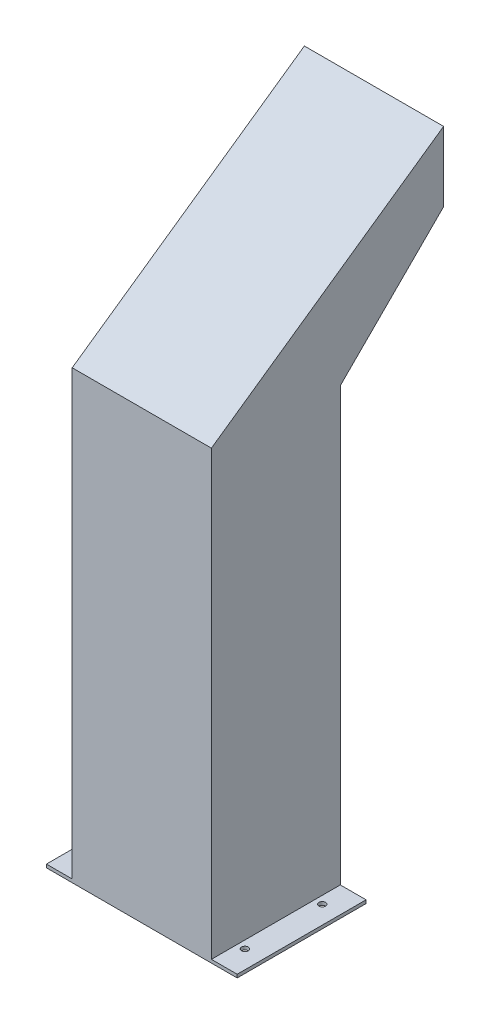
ISO-10303-21;
HEADER;
FILE_DESCRIPTION(('STEP AP214'),'2;1');
FILE_NAME('part.step','',(''),(''),'','','');
FILE_SCHEMA(('AUTOMOTIVE_DESIGN { 1 0 10303 214 1 1 1 1 }'));
ENDSEC;
DATA;
#1=APPLICATION_CONTEXT('core data for automotive mechanical design processes');
#2=APPLICATION_PROTOCOL_DEFINITION('international standard','automotive_design',2000,#1);
#3=PRODUCT_CONTEXT('',#1,'mechanical');
#4=PRODUCT('Part','Part','',(#3));
#5=PRODUCT_RELATED_PRODUCT_CATEGORY('part','',(#4));
#6=PRODUCT_DEFINITION_FORMATION('','',#4);
#7=PRODUCT_DEFINITION_CONTEXT('part definition',#1,'design');
#8=PRODUCT_DEFINITION('design','',#6,#7);
#9=PRODUCT_DEFINITION_SHAPE('','',#8);
#10=(LENGTH_UNIT() NAMED_UNIT(*) SI_UNIT(.MILLI.,.METRE.));
#11=(NAMED_UNIT(*) PLANE_ANGLE_UNIT() SI_UNIT($,.RADIAN.));
#12=(NAMED_UNIT(*) SI_UNIT($,.STERADIAN.) SOLID_ANGLE_UNIT());
#13=UNCERTAINTY_MEASURE_WITH_UNIT(LENGTH_MEASURE(1.E-05),#10,'distance_accuracy_value','');
#14=(GEOMETRIC_REPRESENTATION_CONTEXT(3) GLOBAL_UNCERTAINTY_ASSIGNED_CONTEXT((#13)) GLOBAL_UNIT_ASSIGNED_CONTEXT((#10,
#11,#12)) REPRESENTATION_CONTEXT('',''));
#15=CARTESIAN_POINT('',(0.,0.,0.));
#16=DIRECTION('',(0.,0.,1.));
#17=DIRECTION('',(1.,0.,0.));
#18=AXIS2_PLACEMENT_3D('',#15,#16,#17);
#19=CARTESIAN_POINT('',(135.,1180.3115228242,-325.311522824199));
#20=DIRECTION('',(0.,0.,1.));
#21=DIRECTION('',(1.,0.,0.));
#22=AXIS2_PLACEMENT_3D('',#19,#20,#21);
#23=PLANE('',#22);
#24=DIRECTION('',(0.,1.,0.));
#25=VECTOR('',#24,1.);
#26=CARTESIAN_POINT('',(-135.,1180.3115228242,-325.311522824199));
#27=LINE('',#26,#25);
#28=CARTESIAN_POINT('',(-135.,1045.3115228242,-325.311522824199));
#29=VERTEX_POINT('',#28);
#30=CARTESIAN_POINT('',(-135.,1180.3115228242,-325.311522824199));
#31=VERTEX_POINT('',#30);
#32=EDGE_CURVE('E223',#29,#31,#27,.T.);
#33=ORIENTED_EDGE('',*,*,#32,.T.);
#34=DIRECTION('',(-1.,0.,0.));
#35=VECTOR('',#34,1.);
#36=CARTESIAN_POINT('',(135.,1180.3115228242,-325.311522824199));
#37=LINE('',#36,#35);
#38=CARTESIAN_POINT('',(135.,1180.3115228242,-325.311522824199));
#39=VERTEX_POINT('',#38);
#40=EDGE_CURVE('E229',#39,#31,#37,.T.);
#41=ORIENTED_EDGE('',*,*,#40,.F.);
#42=DIRECTION('',(0.,1.,0.));
#43=VECTOR('',#42,1.);
#44=CARTESIAN_POINT('',(135.,1180.3115228242,-325.311522824199));
#45=LINE('',#44,#43);
#46=CARTESIAN_POINT('',(135.,1045.3115228242,-325.311522824199));
#47=VERTEX_POINT('',#46);
#48=EDGE_CURVE('E215',#47,#39,#45,.T.);
#49=ORIENTED_EDGE('',*,*,#48,.F.);
#50=DIRECTION('',(-1.,0.,0.));
#51=VECTOR('',#50,1.);
#52=CARTESIAN_POINT('',(135.,1045.3115228242,-325.311522824199));
#53=LINE('',#52,#51);
#54=EDGE_CURVE('E232',#47,#29,#53,.T.);
#55=ORIENTED_EDGE('',*,*,#54,.T.);
#56=EDGE_LOOP('',(#33,#41,#49,#55));
#57=FACE_BOUND('',#56,.T.);
#58=DIRECTION('',(0.,1.,0.));
#59=VECTOR('',#58,1.);
#60=CARTESIAN_POINT('',(-125.,1180.3115228242,-325.311522824199));
#61=LINE('',#60,#59);
#62=CARTESIAN_POINT('',(-125.,1059.45365844793,-325.311522824199));
#63=VERTEX_POINT('',#62);
#64=CARTESIAN_POINT('',(-125.,1168.10377693658,-325.311522824199));
#65=VERTEX_POINT('',#64);
#66=EDGE_CURVE('E185',#63,#65,#61,.T.);
#67=ORIENTED_EDGE('',*,*,#66,.F.);
#68=DIRECTION('',(-1.,0.,0.));
#69=VECTOR('',#68,1.);
#70=CARTESIAN_POINT('',(135.,1059.45365844793,-325.311522824199));
#71=LINE('',#70,#69);
#72=CARTESIAN_POINT('',(125.,1059.45365844793,-325.311522824199));
#73=VERTEX_POINT('',#72);
#74=EDGE_CURVE('E179',#73,#63,#71,.T.);
#75=ORIENTED_EDGE('',*,*,#74,.F.);
#76=DIRECTION('',(0.,1.,0.));
#77=VECTOR('',#76,1.);
#78=CARTESIAN_POINT('',(125.,6.35000000000064,-325.311522824199));
#79=LINE('',#78,#77);
#80=CARTESIAN_POINT('',(125.,1168.10377693658,-325.311522824199));
#81=VERTEX_POINT('',#80);
#82=EDGE_CURVE('E50',#73,#81,#79,.T.);
#83=ORIENTED_EDGE('',*,*,#82,.T.);
#84=DIRECTION('',(-1.,0.,0.));
#85=VECTOR('',#84,1.);
#86=CARTESIAN_POINT('',(135.,1168.10377693658,-325.311522824199));
#87=LINE('',#86,#85);
#88=EDGE_CURVE('E193',#81,#65,#87,.T.);
#89=ORIENTED_EDGE('',*,*,#88,.T.);
#90=EDGE_LOOP('',(#67,#75,#83,#89));
#91=FACE_BOUND('',#90,.T.);
#92=ADVANCED_FACE('F33',(#57,#91),#23,.F.);
#93=CARTESIAN_POINT('',(-135.,6.35000000000064,125.));
#94=DIRECTION('',(1.,0.,0.));
#95=DIRECTION('',(0.,0.,-1.));
#96=AXIS2_PLACEMENT_3D('',#93,#94,#95);
#97=PLANE('',#96);
#98=DIRECTION('',(0.,-1.,0.));
#99=VECTOR('',#98,1.);
#100=CARTESIAN_POINT('',(-135.,6.35000000000064,-125.));
#101=LINE('',#100,#99);
#102=CARTESIAN_POINT('',(-135.,845.,-125.));
#103=VERTEX_POINT('',#102);
#104=CARTESIAN_POINT('',(-135.,6.35000000000064,-125.));
#105=VERTEX_POINT('',#104);
#106=EDGE_CURVE('E268',#103,#105,#101,.T.);
#107=ORIENTED_EDGE('',*,*,#106,.T.);
#108=DIRECTION('',(0.,0.,-1.));
#109=VECTOR('',#108,1.);
#110=CARTESIAN_POINT('',(-135.,6.35000000000064,125.));
#111=LINE('',#110,#109);
#112=CARTESIAN_POINT('',(-135.,6.35000000000064,125.));
#113=VERTEX_POINT('',#112);
#114=EDGE_CURVE('E11',#113,#105,#111,.T.);
#115=ORIENTED_EDGE('',*,*,#114,.F.);
#116=DIRECTION('',(0.,-1.,0.));
#117=VECTOR('',#116,1.);
#118=CARTESIAN_POINT('',(-135.,6.35000000000064,125.));
#119=LINE('',#118,#117);
#120=CARTESIAN_POINT('',(-135.,865.,125.));
#121=VERTEX_POINT('',#120);
#122=EDGE_CURVE('E269',#121,#113,#119,.T.);
#123=ORIENTED_EDGE('',*,*,#122,.F.);
#124=DIRECTION('',(0.,-0.573576436351044,0.819152044288993));
#125=VECTOR('',#124,1.);
#126=CARTESIAN_POINT('',(-135.,865.,125.));
#127=LINE('',#126,#125);
#128=EDGE_CURVE('E216',#31,#121,#127,.T.);
#129=ORIENTED_EDGE('',*,*,#128,.F.);
#130=ORIENTED_EDGE('',*,*,#32,.F.);
#131=DIRECTION('',(0.,0.707106781186543,-0.707106781186552));
#132=VECTOR('',#131,1.);
#133=CARTESIAN_POINT('',(-135.,1045.3115228242,-325.311522824199));
#134=LINE('',#133,#132);
#135=EDGE_CURVE('E212',#103,#29,#134,.T.);
#136=ORIENTED_EDGE('',*,*,#135,.F.);
#137=EDGE_LOOP('',(#107,#115,#123,#129,#130,#136));
#138=FACE_BOUND('',#137,.T.);
#139=ADVANCED_FACE('F35',(#138),#97,.F.);
#140=CARTESIAN_POINT('',(-135.,6.35000000000064,125.));
#141=DIRECTION('',(0.,-1.,0.));
#142=DIRECTION('',(1.,0.,0.));
#143=AXIS2_PLACEMENT_3D('',#140,#141,#142);
#144=PLANE('',#143);
#145=CARTESIAN_POINT('',(-150.000000000001,6.35000000000064,74.999999999999));
#146=DIRECTION('',(0.,-1.,0.));
#147=DIRECTION('',(1.,0.,0.));
#148=AXIS2_PLACEMENT_3D('',#145,#146,#147);
#149=CIRCLE('',#148,6.49999999999998);
#150=CARTESIAN_POINT('',(-143.500000000001,6.35000000000064,74.999999999999));
#151=VERTEX_POINT('',#150);
#152=EDGE_CURVE('E335',#151,#151,#149,.T.);
#153=ORIENTED_EDGE('',*,*,#152,.T.);
#154=EDGE_LOOP('',(#153));
#155=FACE_BOUND('',#154,.T.);
#156=CARTESIAN_POINT('',(-150.,6.35000000000064,-75.000000000001));
#157=DIRECTION('',(0.,-1.,0.));
#158=DIRECTION('',(1.,0.,0.));
#159=AXIS2_PLACEMENT_3D('',#156,#157,#158);
#160=CIRCLE('',#159,6.50000000000005);
#161=CARTESIAN_POINT('',(-143.5,6.35000000000064,-75.000000000001));
#162=VERTEX_POINT('',#161);
#163=EDGE_CURVE('E322',#162,#162,#160,.T.);
#164=ORIENTED_EDGE('',*,*,#163,.T.);
#165=EDGE_LOOP('',(#164));
#166=FACE_BOUND('',#165,.T.);
#167=DIRECTION('',(-1.,0.,0.));
#168=VECTOR('',#167,1.);
#169=CARTESIAN_POINT('',(-135.,6.35000000000064,-125.));
#170=LINE('',#169,#168);
#171=CARTESIAN_POINT('',(-185.,6.35000000000064,-125.));
#172=VERTEX_POINT('',#171);
#173=EDGE_CURVE('E288',#105,#172,#170,.T.);
#174=ORIENTED_EDGE('',*,*,#173,.T.);
#175=DIRECTION('',(0.,0.,-1.));
#176=VECTOR('',#175,1.);
#177=CARTESIAN_POINT('',(-185.,6.35000000000064,125.));
#178=LINE('',#177,#176);
#179=CARTESIAN_POINT('',(-185.,6.35000000000064,125.));
#180=VERTEX_POINT('',#179);
#181=EDGE_CURVE('E42',#180,#172,#178,.T.);
#182=ORIENTED_EDGE('',*,*,#181,.F.);
#183=DIRECTION('',(-1.,0.,0.));
#184=VECTOR('',#183,1.);
#185=CARTESIAN_POINT('',(-135.,6.35000000000064,125.));
#186=LINE('',#185,#184);
#187=EDGE_CURVE('E272',#113,#180,#186,.T.);
#188=ORIENTED_EDGE('',*,*,#187,.F.);
#189=ORIENTED_EDGE('',*,*,#114,.T.);
#190=EDGE_LOOP('',(#174,#182,#188,#189));
#191=FACE_BOUND('',#190,.T.);
#192=ADVANCED_FACE('F368',(#155,#166,#191),#144,.F.);
#193=CARTESIAN_POINT('',(-185.,6.35000000000064,125.));
#194=DIRECTION('',(1.,0.,0.));
#195=DIRECTION('',(0.,0.,-1.));
#196=AXIS2_PLACEMENT_3D('',#193,#194,#195);
#197=PLANE('',#196);
#198=DIRECTION('',(0.,-1.,0.));
#199=VECTOR('',#198,1.);
#200=CARTESIAN_POINT('',(-185.,6.35000000000064,-125.));
#201=LINE('',#200,#199);
#202=CARTESIAN_POINT('',(-185.,0.,-125.));
#203=VERTEX_POINT('',#202);
#204=EDGE_CURVE('E290',#172,#203,#201,.T.);
#205=ORIENTED_EDGE('',*,*,#204,.T.);
#206=DIRECTION('',(0.,0.,-1.));
#207=VECTOR('',#206,1.);
#208=CARTESIAN_POINT('',(-185.,0.,125.));
#209=LINE('',#208,#207);
#210=CARTESIAN_POINT('',(-185.,0.,125.));
#211=VERTEX_POINT('',#210);
#212=EDGE_CURVE('E312',#211,#203,#209,.T.);
#213=ORIENTED_EDGE('',*,*,#212,.F.);
#214=DIRECTION('',(0.,-1.,0.));
#215=VECTOR('',#214,1.);
#216=CARTESIAN_POINT('',(-185.,6.35000000000064,125.));
#217=LINE('',#216,#215);
#218=EDGE_CURVE('E275',#180,#211,#217,.T.);
#219=ORIENTED_EDGE('',*,*,#218,.F.);
#220=ORIENTED_EDGE('',*,*,#181,.T.);
#221=EDGE_LOOP('',(#205,#213,#219,#220));
#222=FACE_BOUND('',#221,.T.);
#223=ADVANCED_FACE('F417',(#222),#197,.F.);
#224=CARTESIAN_POINT('',(185.,0.,125.));
#225=DIRECTION('',(0.,1.,0.));
#226=DIRECTION('',(-1.,0.,0.));
#227=AXIS2_PLACEMENT_3D('',#224,#225,#226);
#228=PLANE('',#227);
#229=CARTESIAN_POINT('',(150.,0.,-75.));
#230=DIRECTION('',(0.,-1.,0.));
#231=DIRECTION('',(-1.,0.,0.));
#232=AXIS2_PLACEMENT_3D('',#229,#230,#231);
#233=CIRCLE('',#232,6.50000000000002);
#234=CARTESIAN_POINT('',(143.5,0.,-75.));
#235=VERTEX_POINT('',#234);
#236=EDGE_CURVE('E324',#235,#235,#233,.T.);
#237=ORIENTED_EDGE('',*,*,#236,.F.);
#238=EDGE_LOOP('',(#237));
#239=FACE_BOUND('',#238,.T.);
#240=CARTESIAN_POINT('',(-150.000000000001,0.,74.999999999999));
#241=DIRECTION('',(0.,-1.,0.));
#242=DIRECTION('',(-1.,0.,0.));
#243=AXIS2_PLACEMENT_3D('',#240,#241,#242);
#244=CIRCLE('',#243,6.49999999999998);
#245=CARTESIAN_POINT('',(-156.500000000001,0.,74.999999999999));
#246=VERTEX_POINT('',#245);
#247=EDGE_CURVE('E329',#246,#246,#244,.T.);
#248=ORIENTED_EDGE('',*,*,#247,.F.);
#249=EDGE_LOOP('',(#248));
#250=FACE_BOUND('',#249,.T.);
#251=CARTESIAN_POINT('',(-150.,0.,-75.000000000001));
#252=DIRECTION('',(0.,-1.,0.));
#253=DIRECTION('',(1.,0.,0.));
#254=AXIS2_PLACEMENT_3D('',#251,#252,#253);
#255=CIRCLE('',#254,6.50000000000005);
#256=CARTESIAN_POINT('',(-143.5,0.,-75.000000000001));
#257=VERTEX_POINT('',#256);
#258=EDGE_CURVE('E659',#257,#257,#255,.T.);
#259=ORIENTED_EDGE('',*,*,#258,.F.);
#260=EDGE_LOOP('',(#259));
#261=FACE_BOUND('',#260,.T.);
#262=CARTESIAN_POINT('',(150.,0.,75.));
#263=DIRECTION('',(0.,-1.,0.));
#264=DIRECTION('',(1.,0.,0.));
#265=AXIS2_PLACEMENT_3D('',#262,#263,#264);
#266=CIRCLE('',#265,6.50000000000002);
#267=CARTESIAN_POINT('',(156.5,0.,75.));
#268=VERTEX_POINT('',#267);
#269=EDGE_CURVE('E318',#268,#268,#266,.T.);
#270=ORIENTED_EDGE('',*,*,#269,.F.);
#271=EDGE_LOOP('',(#270));
#272=FACE_BOUND('',#271,.T.);
#273=DIRECTION('',(-1.,0.,0.));
#274=VECTOR('',#273,1.);
#275=CARTESIAN_POINT('',(185.,0.,-118.65));
#276=LINE('',#275,#274);
#277=CARTESIAN_POINT('',(128.650000000003,0.,-118.65));
#278=VERTEX_POINT('',#277);
#279=CARTESIAN_POINT('',(-128.65,0.,-118.65));
#280=VERTEX_POINT('',#279);
#281=EDGE_CURVE('E262',#278,#280,#276,.T.);
#282=ORIENTED_EDGE('',*,*,#281,.T.);
#283=DIRECTION('',(0.,0.,1.));
#284=VECTOR('',#283,1.);
#285=CARTESIAN_POINT('',(-128.65,0.,125.));
#286=LINE('',#285,#284);
#287=CARTESIAN_POINT('',(-128.65,0.,118.65));
#288=VERTEX_POINT('',#287);
#289=EDGE_CURVE('E265',#280,#288,#286,.T.);
#290=ORIENTED_EDGE('',*,*,#289,.T.);
#291=DIRECTION('',(1.,0.,0.));
#292=VECTOR('',#291,1.);
#293=CARTESIAN_POINT('',(185.,0.,118.65));
#294=LINE('',#293,#292);
#295=CARTESIAN_POINT('',(128.650000000004,0.,118.65));
#296=VERTEX_POINT('',#295);
#297=EDGE_CURVE('E250',#288,#296,#294,.T.);
#298=ORIENTED_EDGE('',*,*,#297,.T.);
#299=DIRECTION('',(0.,0.,-1.));
#300=VECTOR('',#299,1.);
#301=CARTESIAN_POINT('',(128.650000000004,0.,125.));
#302=LINE('',#301,#300);
#303=EDGE_CURVE('E259',#296,#278,#302,.T.);
#304=ORIENTED_EDGE('',*,*,#303,.T.);
#305=EDGE_LOOP('',(#282,#290,#298,#304));
#306=FACE_BOUND('',#305,.T.);
#307=DIRECTION('',(1.,0.,0.));
#308=VECTOR('',#307,1.);
#309=CARTESIAN_POINT('',(185.,0.,-125.));
#310=LINE('',#309,#308);
#311=CARTESIAN_POINT('',(185.,0.,-125.));
#312=VERTEX_POINT('',#311);
#313=EDGE_CURVE('E293',#203,#312,#310,.T.);
#314=ORIENTED_EDGE('',*,*,#313,.T.);
#315=DIRECTION('',(0.,0.,-1.));
#316=VECTOR('',#315,1.);
#317=CARTESIAN_POINT('',(185.,0.,125.));
#318=LINE('',#317,#316);
#319=CARTESIAN_POINT('',(185.,0.,125.));
#320=VERTEX_POINT('',#319);
#321=EDGE_CURVE('E309',#320,#312,#318,.T.);
#322=ORIENTED_EDGE('',*,*,#321,.F.);
#323=DIRECTION('',(1.,0.,0.));
#324=VECTOR('',#323,1.);
#325=CARTESIAN_POINT('',(-185.,0.,125.));
#326=LINE('',#325,#324);
#327=EDGE_CURVE('E277',#211,#320,#326,.T.);
#328=ORIENTED_EDGE('',*,*,#327,.F.);
#329=ORIENTED_EDGE('',*,*,#212,.T.);
#330=EDGE_LOOP('',(#314,#322,#328,#329));
#331=FACE_BOUND('',#330,.T.);
#332=ADVANCED_FACE('F413',(#239,#250,#261,#272,#306,#331),#228,.F.);
#333=CARTESIAN_POINT('',(185.,6.35000000000064,125.));
#334=DIRECTION('',(-1.,0.,0.));
#335=DIRECTION('',(0.,0.,1.));
#336=AXIS2_PLACEMENT_3D('',#333,#334,#335);
#337=PLANE('',#336);
#338=DIRECTION('',(0.,1.,0.));
#339=VECTOR('',#338,1.);
#340=CARTESIAN_POINT('',(185.,6.35000000000064,-125.));
#341=LINE('',#340,#339);
#342=CARTESIAN_POINT('',(185.,6.35000000000064,-125.));
#343=VERTEX_POINT('',#342);
#344=EDGE_CURVE('E295',#312,#343,#341,.T.);
#345=ORIENTED_EDGE('',*,*,#344,.T.);
#346=DIRECTION('',(0.,0.,-1.));
#347=VECTOR('',#346,1.);
#348=CARTESIAN_POINT('',(185.,6.35000000000064,125.));
#349=LINE('',#348,#347);
#350=CARTESIAN_POINT('',(185.,6.35000000000064,125.));
#351=VERTEX_POINT('',#350);
#352=EDGE_CURVE('E306',#351,#343,#349,.T.);
#353=ORIENTED_EDGE('',*,*,#352,.F.);
#354=DIRECTION('',(0.,1.,0.));
#355=VECTOR('',#354,1.);
#356=CARTESIAN_POINT('',(185.,6.35000000000064,125.));
#357=LINE('',#356,#355);
#358=EDGE_CURVE('E279',#320,#351,#357,.T.);
#359=ORIENTED_EDGE('',*,*,#358,.F.);
#360=ORIENTED_EDGE('',*,*,#321,.T.);
#361=EDGE_LOOP('',(#345,#353,#359,#360));
#362=FACE_BOUND('',#361,.T.);
#363=ADVANCED_FACE('F409',(#362),#337,.F.);
#364=CARTESIAN_POINT('',(135.,6.35000000000064,125.));
#365=DIRECTION('',(0.,-1.,0.));
#366=DIRECTION('',(0.,0.,-1.));
#367=AXIS2_PLACEMENT_3D('',#364,#365,#366);
#368=PLANE('',#367);
#369=CARTESIAN_POINT('',(150.,6.35000000000064,-75.));
#370=DIRECTION('',(0.,-1.,0.));
#371=DIRECTION('',(0.,0.,-1.));
#372=AXIS2_PLACEMENT_3D('',#369,#370,#371);
#373=CIRCLE('',#372,6.50000000000002);
#374=CARTESIAN_POINT('',(150.,6.35000000000064,-81.5));
#375=VERTEX_POINT('',#374);
#376=EDGE_CURVE('E37',#375,#375,#373,.T.);
#377=ORIENTED_EDGE('',*,*,#376,.T.);
#378=EDGE_LOOP('',(#377));
#379=FACE_BOUND('',#378,.T.);
#380=CARTESIAN_POINT('',(150.,6.35000000000064,75.));
#381=DIRECTION('',(0.,-1.,0.));
#382=DIRECTION('',(0.,0.,-1.));
#383=AXIS2_PLACEMENT_3D('',#380,#381,#382);
#384=CIRCLE('',#383,6.50000000000002);
#385=CARTESIAN_POINT('',(150.,6.35000000000064,68.5));
#386=VERTEX_POINT('',#385);
#387=EDGE_CURVE('E316',#386,#386,#384,.T.);
#388=ORIENTED_EDGE('',*,*,#387,.T.);
#389=EDGE_LOOP('',(#388));
#390=FACE_BOUND('',#389,.T.);
#391=DIRECTION('',(-1.,0.,0.));
#392=VECTOR('',#391,1.);
#393=CARTESIAN_POINT('',(135.,6.35000000000064,-125.));
#394=LINE('',#393,#392);
#395=CARTESIAN_POINT('',(135.,6.35000000000064,-125.));
#396=VERTEX_POINT('',#395);
#397=EDGE_CURVE('E297',#343,#396,#394,.T.);
#398=ORIENTED_EDGE('',*,*,#397,.T.);
#399=DIRECTION('',(0.,0.,-1.));
#400=VECTOR('',#399,1.);
#401=CARTESIAN_POINT('',(135.,6.35000000000064,125.));
#402=LINE('',#401,#400);
#403=CARTESIAN_POINT('',(135.,6.35000000000064,125.));
#404=VERTEX_POINT('',#403);
#405=EDGE_CURVE('E285',#404,#396,#402,.T.);
#406=ORIENTED_EDGE('',*,*,#405,.F.);
#407=DIRECTION('',(-1.,0.,0.));
#408=VECTOR('',#407,1.);
#409=CARTESIAN_POINT('',(135.,6.35000000000064,125.));
#410=LINE('',#409,#408);
#411=EDGE_CURVE('E281',#351,#404,#410,.T.);
#412=ORIENTED_EDGE('',*,*,#411,.F.);
#413=ORIENTED_EDGE('',*,*,#352,.T.);
#414=EDGE_LOOP('',(#398,#406,#412,#413));
#415=FACE_BOUND('',#414,.T.);
#416=ADVANCED_FACE('F405',(#379,#390,#415),#368,.F.);
#417=CARTESIAN_POINT('',(135.,6.35000000000064,125.));
#418=DIRECTION('',(-1.,0.,0.));
#419=DIRECTION('',(0.,0.,1.));
#420=AXIS2_PLACEMENT_3D('',#417,#418,#419);
#421=PLANE('',#420);
#422=DIRECTION('',(0.,1.,0.));
#423=VECTOR('',#422,1.);
#424=CARTESIAN_POINT('',(135.,6.35000000000064,-125.));
#425=LINE('',#424,#423);
#426=CARTESIAN_POINT('',(135.,845.,-125.));
#427=VERTEX_POINT('',#426);
#428=EDGE_CURVE('E299',#396,#427,#425,.T.);
#429=ORIENTED_EDGE('',*,*,#428,.T.);
#430=DIRECTION('',(0.,0.707106781186543,-0.707106781186552));
#431=VECTOR('',#430,1.);
#432=CARTESIAN_POINT('',(135.,1045.3115228242,-325.311522824199));
#433=LINE('',#432,#431);
#434=EDGE_CURVE('E213',#427,#47,#433,.T.);
#435=ORIENTED_EDGE('',*,*,#434,.T.);
#436=ORIENTED_EDGE('',*,*,#48,.T.);
#437=DIRECTION('',(0.,-0.573576436351044,0.819152044288993));
#438=VECTOR('',#437,1.);
#439=CARTESIAN_POINT('',(135.,865.,125.));
#440=LINE('',#439,#438);
#441=CARTESIAN_POINT('',(135.,865.,125.));
#442=VERTEX_POINT('',#441);
#443=EDGE_CURVE('E218',#39,#442,#440,.T.);
#444=ORIENTED_EDGE('',*,*,#443,.T.);
#445=DIRECTION('',(0.,1.,0.));
#446=VECTOR('',#445,1.);
#447=CARTESIAN_POINT('',(135.,6.35000000000064,125.));
#448=LINE('',#447,#446);
#449=EDGE_CURVE('E283',#404,#442,#448,.T.);
#450=ORIENTED_EDGE('',*,*,#449,.F.);
#451=ORIENTED_EDGE('',*,*,#405,.T.);
#452=EDGE_LOOP('',(#429,#435,#436,#444,#450,#451));
#453=FACE_BOUND('',#452,.T.);
#454=ADVANCED_FACE('F398',(#453),#421,.F.);
#455=CARTESIAN_POINT('',(0.,0.,125.));
#456=DIRECTION('',(0.,0.,1.));
#457=DIRECTION('',(1.,0.,0.));
#458=AXIS2_PLACEMENT_3D('',#455,#456,#457);
#459=PLANE('',#458);
#460=ORIENTED_EDGE('',*,*,#122,.T.);
#461=ORIENTED_EDGE('',*,*,#187,.T.);
#462=ORIENTED_EDGE('',*,*,#218,.T.);
#463=ORIENTED_EDGE('',*,*,#327,.T.);
#464=ORIENTED_EDGE('',*,*,#358,.T.);
#465=ORIENTED_EDGE('',*,*,#411,.T.);
#466=ORIENTED_EDGE('',*,*,#449,.T.);
#467=DIRECTION('',(-1.,0.,0.));
#468=VECTOR('',#467,1.);
#469=CARTESIAN_POINT('',(135.,865.,125.));
#470=LINE('',#469,#468);
#471=EDGE_CURVE('E221',#442,#121,#470,.T.);
#472=ORIENTED_EDGE('',*,*,#471,.T.);
#473=EDGE_LOOP('',(#460,#461,#462,#463,#464,#465,#466,#472));
#474=FACE_BOUND('',#473,.T.);
#475=ADVANCED_FACE('F395',(#474),#459,.T.);
#476=CARTESIAN_POINT('',(0.,0.,-125.));
#477=DIRECTION('',(0.,0.,1.));
#478=DIRECTION('',(1.,0.,0.));
#479=AXIS2_PLACEMENT_3D('',#476,#477,#478);
#480=PLANE('',#479);
#481=ORIENTED_EDGE('',*,*,#106,.F.);
#482=DIRECTION('',(-1.,0.,0.));
#483=VECTOR('',#482,1.);
#484=CARTESIAN_POINT('',(135.,845.,-125.));
#485=LINE('',#484,#483);
#486=EDGE_CURVE('E273',#427,#103,#485,.T.);
#487=ORIENTED_EDGE('',*,*,#486,.F.);
#488=ORIENTED_EDGE('',*,*,#428,.F.);
#489=ORIENTED_EDGE('',*,*,#397,.F.);
#490=ORIENTED_EDGE('',*,*,#344,.F.);
#491=ORIENTED_EDGE('',*,*,#313,.F.);
#492=ORIENTED_EDGE('',*,*,#204,.F.);
#493=ORIENTED_EDGE('',*,*,#173,.F.);
#494=EDGE_LOOP('',(#481,#487,#488,#489,#490,#491,#492,#493));
#495=FACE_BOUND('',#494,.T.);
#496=ADVANCED_FACE('F393',(#495),#480,.F.);
#497=CARTESIAN_POINT('',(-128.649999999999,-155.000000000001,118.65));
#498=DIRECTION('',(-1.,0.,0.));
#499=DIRECTION('',(0.,-1.,0.));
#500=AXIS2_PLACEMENT_3D('',#497,#498,#499);
#501=PLANE('',#500);
#502=DIRECTION('',(0.,1.,0.));
#503=VECTOR('',#502,1.);
#504=CARTESIAN_POINT('',(-128.649999999999,-155.000000000001,-118.65));
#505=LINE('',#504,#503);
#506=CARTESIAN_POINT('',(-128.650000000003,844.999999999999,-118.65));
#507=VERTEX_POINT('',#506);
#508=EDGE_CURVE('E247',#280,#507,#505,.T.);
#509=ORIENTED_EDGE('',*,*,#508,.T.);
#510=DIRECTION('',(0.,0.,1.));
#511=VECTOR('',#510,1.);
#512=CARTESIAN_POINT('',(-128.650000000003,844.999999999999,118.65));
#513=LINE('',#512,#511);
#514=CARTESIAN_POINT('',(-128.650000000003,845.,118.65));
#515=VERTEX_POINT('',#514);
#516=EDGE_CURVE('E235',#507,#515,#513,.T.);
#517=ORIENTED_EDGE('',*,*,#516,.T.);
#518=DIRECTION('',(0.,1.,0.));
#519=VECTOR('',#518,1.);
#520=CARTESIAN_POINT('',(-128.649999999999,-155.000000000001,118.65));
#521=LINE('',#520,#519);
#522=EDGE_CURVE('E246',#288,#515,#521,.T.);
#523=ORIENTED_EDGE('',*,*,#522,.F.);
#524=ORIENTED_EDGE('',*,*,#289,.F.);
#525=EDGE_LOOP('',(#509,#517,#523,#524));
#526=FACE_BOUND('',#525,.T.);
#527=ADVANCED_FACE('F384',(#526),#501,.F.);
#528=CARTESIAN_POINT('',(-128.649999999999,-155.000000000001,-118.65));
#529=DIRECTION('',(0.,0.,-1.));
#530=DIRECTION('',(-1.,0.,0.));
#531=AXIS2_PLACEMENT_3D('',#528,#529,#530);
#532=PLANE('',#531);
#533=DIRECTION('',(0.,1.,0.));
#534=VECTOR('',#533,1.);
#535=CARTESIAN_POINT('',(128.650000000004,-154.999999999999,-118.65));
#536=LINE('',#535,#534);
#537=CARTESIAN_POINT('',(128.65,845.000000000001,-118.65));
#538=VERTEX_POINT('',#537);
#539=EDGE_CURVE('E251',#278,#538,#536,.T.);
#540=ORIENTED_EDGE('',*,*,#539,.T.);
#541=DIRECTION('',(-1.,0.,0.));
#542=VECTOR('',#541,1.);
#543=CARTESIAN_POINT('',(-128.650000000003,844.999999999999,-118.65));
#544=LINE('',#543,#542);
#545=EDGE_CURVE('E243',#538,#507,#544,.T.);
#546=ORIENTED_EDGE('',*,*,#545,.T.);
#547=ORIENTED_EDGE('',*,*,#508,.F.);
#548=ORIENTED_EDGE('',*,*,#281,.F.);
#549=EDGE_LOOP('',(#540,#546,#547,#548));
#550=FACE_BOUND('',#549,.T.);
#551=ADVANCED_FACE('F380',(#550),#532,.F.);
#552=CARTESIAN_POINT('',(128.650000000004,-154.999999999999,-118.65));
#553=DIRECTION('',(1.,0.,0.));
#554=DIRECTION('',(0.,1.,0.));
#555=AXIS2_PLACEMENT_3D('',#552,#553,#554);
#556=PLANE('',#555);
#557=DIRECTION('',(0.,1.,0.));
#558=VECTOR('',#557,1.);
#559=CARTESIAN_POINT('',(128.650000000004,-154.999999999999,118.65));
#560=LINE('',#559,#558);
#561=CARTESIAN_POINT('',(128.65,845.000000000001,118.65));
#562=VERTEX_POINT('',#561);
#563=EDGE_CURVE('E58',#296,#562,#560,.T.);
#564=ORIENTED_EDGE('',*,*,#563,.T.);
#565=DIRECTION('',(0.,0.,-1.));
#566=VECTOR('',#565,1.);
#567=CARTESIAN_POINT('',(128.65,845.000000000001,-118.65));
#568=LINE('',#567,#566);
#569=EDGE_CURVE('E240',#562,#538,#568,.T.);
#570=ORIENTED_EDGE('',*,*,#569,.T.);
#571=ORIENTED_EDGE('',*,*,#539,.F.);
#572=ORIENTED_EDGE('',*,*,#303,.F.);
#573=EDGE_LOOP('',(#564,#570,#571,#572));
#574=FACE_BOUND('',#573,.T.);
#575=ADVANCED_FACE('F383',(#574),#556,.F.);
#576=CARTESIAN_POINT('',(128.650000000004,-154.999999999999,118.65));
#577=DIRECTION('',(0.,0.,1.));
#578=DIRECTION('',(1.,0.,0.));
#579=AXIS2_PLACEMENT_3D('',#576,#577,#578);
#580=PLANE('',#579);
#581=ORIENTED_EDGE('',*,*,#522,.T.);
#582=DIRECTION('',(1.,0.,0.));
#583=VECTOR('',#582,1.);
#584=CARTESIAN_POINT('',(128.65,845.000000000001,118.65));
#585=LINE('',#584,#583);
#586=EDGE_CURVE('E238',#515,#562,#585,.T.);
#587=ORIENTED_EDGE('',*,*,#586,.T.);
#588=ORIENTED_EDGE('',*,*,#563,.F.);
#589=ORIENTED_EDGE('',*,*,#297,.F.);
#590=EDGE_LOOP('',(#581,#587,#588,#589));
#591=FACE_BOUND('',#590,.T.);
#592=ADVANCED_FACE('F378',(#591),#580,.F.);
#593=CARTESIAN_POINT('',(135.,845.,125.));
#594=DIRECTION('',(0.,1.,0.));
#595=DIRECTION('',(0.,0.,1.));
#596=AXIS2_PLACEMENT_3D('',#593,#594,#595);
#597=PLANE('',#596);
#598=ORIENTED_EDGE('',*,*,#586,.F.);
#599=ORIENTED_EDGE('',*,*,#516,.F.);
#600=ORIENTED_EDGE('',*,*,#545,.F.);
#601=ORIENTED_EDGE('',*,*,#569,.F.);
#602=EDGE_LOOP('',(#598,#599,#600,#601));
#603=FACE_BOUND('',#602,.T.);
#604=ADVANCED_FACE('F374',(#603),#597,.F.);
#605=CARTESIAN_POINT('',(135.,1045.3115228242,-325.311522824199));
#606=DIRECTION('',(0.,0.707106781186552,0.707106781186543));
#607=DIRECTION('',(0.,-0.707106781186543,0.707106781186552));
#608=AXIS2_PLACEMENT_3D('',#605,#606,#607);
#609=PLANE('',#608);
#610=ORIENTED_EDGE('',*,*,#135,.T.);
#611=ORIENTED_EDGE('',*,*,#54,.F.);
#612=ORIENTED_EDGE('',*,*,#434,.F.);
#613=ORIENTED_EDGE('',*,*,#486,.T.);
#614=EDGE_LOOP('',(#610,#611,#612,#613));
#615=FACE_BOUND('',#614,.T.);
#616=ADVANCED_FACE('F357',(#615),#609,.F.);
#617=CARTESIAN_POINT('',(135.,865.,125.));
#618=DIRECTION('',(0.,-0.819152044288993,-0.573576436351044));
#619=DIRECTION('',(0.,0.573576436351044,-0.819152044288993));
#620=AXIS2_PLACEMENT_3D('',#617,#618,#619);
#621=PLANE('',#620);
#622=ORIENTED_EDGE('',*,*,#128,.T.);
#623=ORIENTED_EDGE('',*,*,#471,.F.);
#624=ORIENTED_EDGE('',*,*,#443,.F.);
#625=ORIENTED_EDGE('',*,*,#40,.T.);
#626=EDGE_LOOP('',(#622,#623,#624,#625));
#627=FACE_BOUND('',#626,.T.);
#628=ADVANCED_FACE('F350',(#627),#621,.F.);
#629=CARTESIAN_POINT('',(135.,855.,125.));
#630=DIRECTION('',(0.,1.,0.));
#631=DIRECTION('',(0.,0.,1.));
#632=AXIS2_PLACEMENT_3D('',#629,#630,#631);
#633=PLANE('',#632);
#634=DIRECTION('',(0.,0.,1.));
#635=VECTOR('',#634,1.);
#636=CARTESIAN_POINT('',(-125.,855.,125.));
#637=LINE('',#636,#635);
#638=CARTESIAN_POINT('',(-125.,855.,-120.857864376269));
#639=VERTEX_POINT('',#638);
#640=CARTESIAN_POINT('',(-125.,855.,115.));
#641=VERTEX_POINT('',#640);
#642=EDGE_CURVE('E207',#639,#641,#637,.T.);
#643=ORIENTED_EDGE('',*,*,#642,.T.);
#644=DIRECTION('',(-1.,0.,0.));
#645=VECTOR('',#644,1.);
#646=CARTESIAN_POINT('',(0.,855.,115.));
#647=LINE('',#646,#645);
#648=CARTESIAN_POINT('',(125.,855.,115.));
#649=VERTEX_POINT('',#648);
#650=EDGE_CURVE('E175',#649,#641,#647,.T.);
#651=ORIENTED_EDGE('',*,*,#650,.F.);
#652=DIRECTION('',(0.,0.,-1.));
#653=VECTOR('',#652,1.);
#654=CARTESIAN_POINT('',(125.,855.,125.));
#655=LINE('',#654,#653);
#656=CARTESIAN_POINT('',(125.,855.,-120.857864376269));
#657=VERTEX_POINT('',#656);
#658=EDGE_CURVE('E205',#649,#657,#655,.T.);
#659=ORIENTED_EDGE('',*,*,#658,.T.);
#660=DIRECTION('',(1.,0.,0.));
#661=VECTOR('',#660,1.);
#662=CARTESIAN_POINT('',(135.,855.,-120.857864376269));
#663=LINE('',#662,#661);
#664=EDGE_CURVE('E209',#639,#657,#663,.T.);
#665=ORIENTED_EDGE('',*,*,#664,.F.);
#666=EDGE_LOOP('',(#643,#651,#659,#665));
#667=FACE_BOUND('',#666,.T.);
#668=ADVANCED_FACE('F348',(#667),#633,.T.);
#669=CARTESIAN_POINT('',(-125.,6.35000000000064,125.));
#670=DIRECTION('',(1.,0.,0.));
#671=DIRECTION('',(0.,0.,-1.));
#672=AXIS2_PLACEMENT_3D('',#669,#670,#671);
#673=PLANE('',#672);
#674=DIRECTION('',(0.,0.707106781186543,-0.707106781186552));
#675=VECTOR('',#674,1.);
#676=CARTESIAN_POINT('',(-125.,1052.38259063606,-318.240455012333));
#677=LINE('',#676,#675);
#678=EDGE_CURVE('E199',#639,#63,#677,.T.);
#679=ORIENTED_EDGE('',*,*,#678,.T.);
#680=ORIENTED_EDGE('',*,*,#66,.T.);
#681=DIRECTION('',(0.,-0.573576436351044,0.819152044288993));
#682=VECTOR('',#681,1.);
#683=CARTESIAN_POINT('',(-125.,856.80847955711,119.26423563649));
#684=LINE('',#683,#682);
#685=CARTESIAN_POINT('',(-125.,859.794329494483,115.));
#686=VERTEX_POINT('',#685);
#687=EDGE_CURVE('E182',#65,#686,#684,.T.);
#688=ORIENTED_EDGE('',*,*,#687,.T.);
#689=DIRECTION('',(0.,-1.,0.));
#690=VECTOR('',#689,1.);
#691=CARTESIAN_POINT('',(-125.,6.35000000000064,115.));
#692=LINE('',#691,#690);
#693=EDGE_CURVE('E169',#686,#641,#692,.T.);
#694=ORIENTED_EDGE('',*,*,#693,.T.);
#695=ORIENTED_EDGE('',*,*,#642,.F.);
#696=EDGE_LOOP('',(#679,#680,#688,#694,#695));
#697=FACE_BOUND('',#696,.T.);
#698=ADVANCED_FACE('F183',(#697),#673,.T.);
#699=CARTESIAN_POINT('',(125.,6.35000000000064,125.));
#700=DIRECTION('',(-1.,0.,0.));
#701=DIRECTION('',(0.,0.,1.));
#702=AXIS2_PLACEMENT_3D('',#699,#700,#701);
#703=PLANE('',#702);
#704=DIRECTION('',(0.,1.,0.));
#705=VECTOR('',#704,1.);
#706=CARTESIAN_POINT('',(125.,6.35000000000064,115.));
#707=LINE('',#706,#705);
#708=CARTESIAN_POINT('',(125.,859.794329494483,115.));
#709=VERTEX_POINT('',#708);
#710=EDGE_CURVE('E178',#649,#709,#707,.T.);
#711=ORIENTED_EDGE('',*,*,#710,.T.);
#712=DIRECTION('',(0.,-0.573576436351044,0.819152044288993));
#713=VECTOR('',#712,1.);
#714=CARTESIAN_POINT('',(125.,574.321277590405,522.697770055399));
#715=LINE('',#714,#713);
#716=EDGE_CURVE('E192',#81,#709,#715,.T.);
#717=ORIENTED_EDGE('',*,*,#716,.F.);
#718=ORIENTED_EDGE('',*,*,#82,.F.);
#719=DIRECTION('',(0.,0.707106781186543,-0.707106781186552));
#720=VECTOR('',#719,1.);
#721=CARTESIAN_POINT('',(125.,307.746067811871,426.396067811867));
#722=LINE('',#721,#720);
#723=EDGE_CURVE('E188',#657,#73,#722,.T.);
#724=ORIENTED_EDGE('',*,*,#723,.F.);
#725=ORIENTED_EDGE('',*,*,#658,.F.);
#726=EDGE_LOOP('',(#711,#717,#718,#724,#725));
#727=FACE_BOUND('',#726,.T.);
#728=ADVANCED_FACE('F346',(#727),#703,.T.);
#729=CARTESIAN_POINT('',(0.,0.,115.));
#730=DIRECTION('',(0.,0.,1.));
#731=DIRECTION('',(1.,0.,0.));
#732=AXIS2_PLACEMENT_3D('',#729,#730,#731);
#733=PLANE('',#732);
#734=ORIENTED_EDGE('',*,*,#650,.T.);
#735=ORIENTED_EDGE('',*,*,#693,.F.);
#736=DIRECTION('',(-1.,0.,0.));
#737=VECTOR('',#736,1.);
#738=CARTESIAN_POINT('',(135.,859.794329494483,115.));
#739=LINE('',#738,#737);
#740=EDGE_CURVE('E174',#709,#686,#739,.T.);
#741=ORIENTED_EDGE('',*,*,#740,.F.);
#742=ORIENTED_EDGE('',*,*,#710,.F.);
#743=EDGE_LOOP('',(#734,#735,#741,#742));
#744=FACE_BOUND('',#743,.T.);
#745=ADVANCED_FACE('F171',(#744),#733,.F.);
#746=CARTESIAN_POINT('',(135.,1052.38259063606,-318.240455012333));
#747=DIRECTION('',(0.,0.707106781186552,0.707106781186543));
#748=DIRECTION('',(0.,-0.707106781186543,0.707106781186552));
#749=AXIS2_PLACEMENT_3D('',#746,#747,#748);
#750=PLANE('',#749);
#751=ORIENTED_EDGE('',*,*,#664,.T.);
#752=ORIENTED_EDGE('',*,*,#723,.T.);
#753=ORIENTED_EDGE('',*,*,#74,.T.);
#754=ORIENTED_EDGE('',*,*,#678,.F.);
#755=EDGE_LOOP('',(#751,#752,#753,#754));
#756=FACE_BOUND('',#755,.T.);
#757=ADVANCED_FACE('F341',(#756),#750,.T.);
#758=CARTESIAN_POINT('',(135.,856.80847955711,119.26423563649));
#759=DIRECTION('',(0.,-0.819152044288993,-0.573576436351044));
#760=DIRECTION('',(0.,0.573576436351044,-0.819152044288993));
#761=AXIS2_PLACEMENT_3D('',#758,#759,#760);
#762=PLANE('',#761);
#763=ORIENTED_EDGE('',*,*,#687,.F.);
#764=ORIENTED_EDGE('',*,*,#88,.F.);
#765=ORIENTED_EDGE('',*,*,#716,.T.);
#766=ORIENTED_EDGE('',*,*,#740,.T.);
#767=EDGE_LOOP('',(#763,#764,#765,#766));
#768=FACE_BOUND('',#767,.T.);
#769=ADVANCED_FACE('F191',(#768),#762,.T.);
#770=CARTESIAN_POINT('',(150.,30.,75.));
#771=DIRECTION('',(0.,-1.,0.));
#772=DIRECTION('',(1.,0.,0.));
#773=AXIS2_PLACEMENT_3D('',#770,#771,#772);
#774=CYLINDRICAL_SURFACE('',#773,6.50000000000002);
#775=ORIENTED_EDGE('',*,*,#269,.T.);
#776=EDGE_LOOP('',(#775));
#777=FACE_BOUND('',#776,.T.);
#778=ORIENTED_EDGE('',*,*,#387,.F.);
#779=EDGE_LOOP('',(#778));
#780=FACE_BOUND('',#779,.T.);
#781=ADVANCED_FACE('F468',(#777,#780),#774,.F.);
#782=CARTESIAN_POINT('',(150.,30.,-75.));
#783=DIRECTION('',(0.,-1.,0.));
#784=DIRECTION('',(1.,0.,0.));
#785=AXIS2_PLACEMENT_3D('',#782,#783,#784);
#786=CYLINDRICAL_SURFACE('',#785,6.50000000000002);
#787=ORIENTED_EDGE('',*,*,#236,.T.);
#788=EDGE_LOOP('',(#787));
#789=FACE_BOUND('',#788,.T.);
#790=ORIENTED_EDGE('',*,*,#376,.F.);
#791=EDGE_LOOP('',(#790));
#792=FACE_BOUND('',#791,.T.);
#793=ADVANCED_FACE('F459',(#789,#792),#786,.F.);
#794=CARTESIAN_POINT('',(-150.,30.,-75.000000000001));
#795=DIRECTION('',(0.,-1.,0.));
#796=DIRECTION('',(1.,0.,0.));
#797=AXIS2_PLACEMENT_3D('',#794,#795,#796);
#798=CYLINDRICAL_SURFACE('',#797,6.50000000000005);
#799=ORIENTED_EDGE('',*,*,#258,.T.);
#800=EDGE_LOOP('',(#799));
#801=FACE_BOUND('',#800,.T.);
#802=ORIENTED_EDGE('',*,*,#163,.F.);
#803=EDGE_LOOP('',(#802));
#804=FACE_BOUND('',#803,.T.);
#805=ADVANCED_FACE('F456',(#801,#804),#798,.F.);
#806=CARTESIAN_POINT('',(-150.000000000001,30.,74.999999999999));
#807=DIRECTION('',(0.,-1.,0.));
#808=DIRECTION('',(1.,0.,0.));
#809=AXIS2_PLACEMENT_3D('',#806,#807,#808);
#810=CYLINDRICAL_SURFACE('',#809,6.49999999999998);
#811=ORIENTED_EDGE('',*,*,#247,.T.);
#812=EDGE_LOOP('',(#811));
#813=FACE_BOUND('',#812,.T.);
#814=ORIENTED_EDGE('',*,*,#152,.F.);
#815=EDGE_LOOP('',(#814));
#816=FACE_BOUND('',#815,.T.);
#817=ADVANCED_FACE('F458',(#813,#816),#810,.F.);
#818=CLOSED_SHELL('',(#92,#139,#192,#223,#332,#363,#416,#454,#475,#496,#527,#551,#575,#592,#604,
#616,#628,#668,#698,#728,#745,#757,#769,#781,#793,#805,#817));
#819=MANIFOLD_SOLID_BREP('B2',#818);
#820=ADVANCED_BREP_SHAPE_REPRESENTATION('',(#18,#819),#14);
#821=SHAPE_DEFINITION_REPRESENTATION(#9,#820);
ENDSEC;
END-ISO-10303-21;
